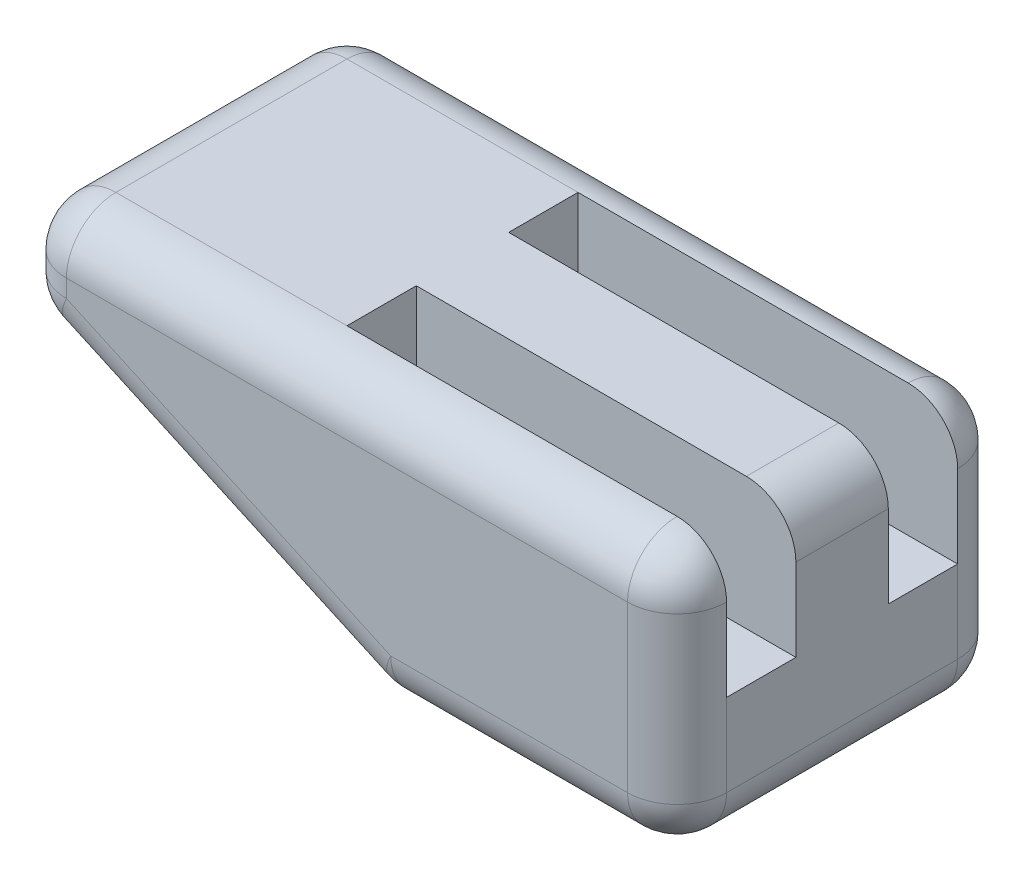
ISO-10303-21;
HEADER;
FILE_DESCRIPTION(('STEP AP214'),'2;1');
FILE_NAME('part.step','',(''),(''),'','','');
FILE_SCHEMA(('AUTOMOTIVE_DESIGN { 1 0 10303 214 1 1 1 1 }'));
ENDSEC;
DATA;
#1=APPLICATION_CONTEXT('core data for automotive mechanical design processes');
#2=APPLICATION_PROTOCOL_DEFINITION('international standard','automotive_design',2000,#1);
#3=PRODUCT_CONTEXT('',#1,'mechanical');
#4=PRODUCT('Part','Part','',(#3));
#5=PRODUCT_RELATED_PRODUCT_CATEGORY('part','',(#4));
#6=PRODUCT_DEFINITION_FORMATION('','',#4);
#7=PRODUCT_DEFINITION_CONTEXT('part definition',#1,'design');
#8=PRODUCT_DEFINITION('design','',#6,#7);
#9=PRODUCT_DEFINITION_SHAPE('','',#8);
#10=(LENGTH_UNIT() NAMED_UNIT(*) SI_UNIT(.MILLI.,.METRE.));
#11=(NAMED_UNIT(*) PLANE_ANGLE_UNIT() SI_UNIT($,.RADIAN.));
#12=(NAMED_UNIT(*) SI_UNIT($,.STERADIAN.) SOLID_ANGLE_UNIT());
#13=UNCERTAINTY_MEASURE_WITH_UNIT(LENGTH_MEASURE(1.E-05),#10,'distance_accuracy_value','');
#14=(GEOMETRIC_REPRESENTATION_CONTEXT(3) GLOBAL_UNCERTAINTY_ASSIGNED_CONTEXT((#13)) GLOBAL_UNIT_ASSIGNED_CONTEXT((#10,
#11,#12)) REPRESENTATION_CONTEXT('',''));
#15=CARTESIAN_POINT('',(0.,0.,0.));
#16=DIRECTION('',(0.,0.,1.));
#17=DIRECTION('',(1.,0.,0.));
#18=AXIS2_PLACEMENT_3D('',#15,#16,#17);
#19=CARTESIAN_POINT('',(0.,-4.,1.5));
#20=DIRECTION('',(0.,0.,-1.));
#21=DIRECTION('',(0.,-1.,0.));
#22=AXIS2_PLACEMENT_3D('',#19,#20,#21);
#23=PLANE('',#22);
#24=DIRECTION('',(0.,1.,0.));
#25=VECTOR('',#24,1.);
#26=CARTESIAN_POINT('',(20.,-8.,1.5));
#27=LINE('',#26,#25);
#28=CARTESIAN_POINT('',(20.,-4.,1.5));
#29=VERTEX_POINT('',#28);
#30=CARTESIAN_POINT('',(20.,-1.5,1.5));
#31=VERTEX_POINT('',#30);
#32=EDGE_CURVE('E227',#29,#31,#27,.T.);
#33=ORIENTED_EDGE('',*,*,#32,.T.);
#34=CARTESIAN_POINT('',(18.5,-1.5,1.5));
#35=DIRECTION('',(0.,0.,1.));
#36=DIRECTION('',(-1.,0.,0.));
#37=AXIS2_PLACEMENT_3D('',#34,#35,#36);
#38=CIRCLE('',#37,1.5);
#39=CARTESIAN_POINT('',(18.5,0.,1.5));
#40=VERTEX_POINT('',#39);
#41=EDGE_CURVE('E487',#31,#40,#38,.T.);
#42=ORIENTED_EDGE('',*,*,#41,.T.);
#43=DIRECTION('',(-1.,0.,0.));
#44=VECTOR('',#43,1.);
#45=CARTESIAN_POINT('',(20.,0.,1.5));
#46=LINE('',#45,#44);
#47=CARTESIAN_POINT('',(8.5,0.,1.5));
#48=VERTEX_POINT('',#47);
#49=EDGE_CURVE('E393',#40,#48,#46,.T.);
#50=ORIENTED_EDGE('',*,*,#49,.T.);
#51=DIRECTION('',(0.,1.,0.));
#52=VECTOR('',#51,1.);
#53=CARTESIAN_POINT('',(8.5,-4.,1.5));
#54=LINE('',#53,#52);
#55=CARTESIAN_POINT('',(8.5,-4.,1.5));
#56=VERTEX_POINT('',#55);
#57=EDGE_CURVE('E11',#56,#48,#54,.T.);
#58=ORIENTED_EDGE('',*,*,#57,.F.);
#59=DIRECTION('',(-1.,0.,0.));
#60=VECTOR('',#59,1.);
#61=CARTESIAN_POINT('',(0.,-4.,1.5));
#62=LINE('',#61,#60);
#63=EDGE_CURVE('E223',#29,#56,#62,.T.);
#64=ORIENTED_EDGE('',*,*,#63,.F.);
#65=EDGE_LOOP('',(#33,#42,#50,#58,#64));
#66=FACE_BOUND('',#65,.T.);
#67=ADVANCED_FACE('F17',(#66),#23,.F.);
#68=CARTESIAN_POINT('',(8.5,-4.,0.));
#69=DIRECTION('',(1.,0.,0.));
#70=DIRECTION('',(0.,1.,0.));
#71=AXIS2_PLACEMENT_3D('',#68,#69,#70);
#72=PLANE('',#71);
#73=DIRECTION('',(0.,0.,-1.));
#74=VECTOR('',#73,1.);
#75=CARTESIAN_POINT('',(8.5,0.,0.));
#76=LINE('',#75,#74);
#77=CARTESIAN_POINT('',(8.5,0.,3.6));
#78=VERTEX_POINT('',#77);
#79=EDGE_CURVE('E545',#78,#48,#76,.T.);
#80=ORIENTED_EDGE('',*,*,#79,.F.);
#81=DIRECTION('',(0.,1.,0.));
#82=VECTOR('',#81,1.);
#83=CARTESIAN_POINT('',(8.5,-4.,3.6));
#84=LINE('',#83,#82);
#85=CARTESIAN_POINT('',(8.5,-4.,3.6));
#86=VERTEX_POINT('',#85);
#87=EDGE_CURVE('E27',#86,#78,#84,.T.);
#88=ORIENTED_EDGE('',*,*,#87,.F.);
#89=DIRECTION('',(0.,0.,-1.));
#90=VECTOR('',#89,1.);
#91=CARTESIAN_POINT('',(8.5,-4.,0.));
#92=LINE('',#91,#90);
#93=EDGE_CURVE('E20',#86,#56,#92,.T.);
#94=ORIENTED_EDGE('',*,*,#93,.T.);
#95=ORIENTED_EDGE('',*,*,#57,.T.);
#96=EDGE_LOOP('',(#80,#88,#94,#95));
#97=FACE_BOUND('',#96,.T.);
#98=ADVANCED_FACE('F630',(#97),#72,.T.);
#99=CARTESIAN_POINT('',(0.,-4.,3.6));
#100=DIRECTION('',(0.,0.,-1.));
#101=DIRECTION('',(-1.,0.,0.));
#102=AXIS2_PLACEMENT_3D('',#99,#100,#101);
#103=PLANE('',#102);
#104=DIRECTION('',(0.,-1.,0.));
#105=VECTOR('',#104,1.);
#106=CARTESIAN_POINT('',(20.,-8.,3.6));
#107=LINE('',#106,#105);
#108=CARTESIAN_POINT('',(20.,-1.5,3.6));
#109=VERTEX_POINT('',#108);
#110=CARTESIAN_POINT('',(20.,-4.,3.6));
#111=VERTEX_POINT('',#110);
#112=EDGE_CURVE('E254',#109,#111,#107,.T.);
#113=ORIENTED_EDGE('',*,*,#112,.T.);
#114=DIRECTION('',(-1.,0.,0.));
#115=VECTOR('',#114,1.);
#116=CARTESIAN_POINT('',(0.,-4.,3.6));
#117=LINE('',#116,#115);
#118=EDGE_CURVE('E249',#111,#86,#117,.T.);
#119=ORIENTED_EDGE('',*,*,#118,.T.);
#120=ORIENTED_EDGE('',*,*,#87,.T.);
#121=DIRECTION('',(-1.,0.,0.));
#122=VECTOR('',#121,1.);
#123=CARTESIAN_POINT('',(0.,0.,3.6));
#124=LINE('',#123,#122);
#125=CARTESIAN_POINT('',(18.5,0.,3.6));
#126=VERTEX_POINT('',#125);
#127=EDGE_CURVE('E550',#126,#78,#124,.T.);
#128=ORIENTED_EDGE('',*,*,#127,.F.);
#129=CARTESIAN_POINT('',(18.5,-1.5,3.6));
#130=DIRECTION('',(0.,0.,1.));
#131=DIRECTION('',(-1.,0.,0.));
#132=AXIS2_PLACEMENT_3D('',#129,#130,#131);
#133=CIRCLE('',#132,1.5);
#134=EDGE_CURVE('E288',#109,#126,#133,.T.);
#135=ORIENTED_EDGE('',*,*,#134,.F.);
#136=EDGE_LOOP('',(#113,#119,#120,#128,#135));
#137=FACE_BOUND('',#136,.T.);
#138=ADVANCED_FACE('F564',(#137),#103,.T.);
#139=CARTESIAN_POINT('',(0.,-4.,0.));
#140=DIRECTION('',(0.,1.,0.));
#141=DIRECTION('',(1.,0.,0.));
#142=AXIS2_PLACEMENT_3D('',#139,#140,#141);
#143=PLANE('',#142);
#144=DIRECTION('',(0.,0.,-1.));
#145=VECTOR('',#144,1.);
#146=CARTESIAN_POINT('',(20.,-4.,10.));
#147=LINE('',#146,#145);
#148=EDGE_CURVE('E248',#111,#29,#147,.T.);
#149=ORIENTED_EDGE('',*,*,#148,.T.);
#150=ORIENTED_EDGE('',*,*,#63,.T.);
#151=ORIENTED_EDGE('',*,*,#93,.F.);
#152=ORIENTED_EDGE('',*,*,#118,.F.);
#153=EDGE_LOOP('',(#149,#150,#151,#152));
#154=FACE_BOUND('',#153,.T.);
#155=ADVANCED_FACE('F247',(#154),#143,.T.);
#156=CARTESIAN_POINT('',(8.5,-4.,0.));
#157=DIRECTION('',(-1.,0.,0.));
#158=DIRECTION('',(0.,1.,0.));
#159=AXIS2_PLACEMENT_3D('',#156,#157,#158);
#160=PLANE('',#159);
#161=DIRECTION('',(0.,0.,1.));
#162=VECTOR('',#161,1.);
#163=CARTESIAN_POINT('',(8.5,0.,0.));
#164=LINE('',#163,#162);
#165=CARTESIAN_POINT('',(8.5,0.,6.4));
#166=VERTEX_POINT('',#165);
#167=CARTESIAN_POINT('',(8.5,0.,8.5));
#168=VERTEX_POINT('',#167);
#169=EDGE_CURVE('E527',#166,#168,#164,.T.);
#170=ORIENTED_EDGE('',*,*,#169,.T.);
#171=DIRECTION('',(0.,1.,0.));
#172=VECTOR('',#171,1.);
#173=CARTESIAN_POINT('',(8.5,-4.,8.5));
#174=LINE('',#173,#172);
#175=CARTESIAN_POINT('',(8.5,-4.,8.5));
#176=VERTEX_POINT('',#175);
#177=EDGE_CURVE('E233',#176,#168,#174,.T.);
#178=ORIENTED_EDGE('',*,*,#177,.F.);
#179=DIRECTION('',(0.,0.,1.));
#180=VECTOR('',#179,1.);
#181=CARTESIAN_POINT('',(8.5,-4.,0.));
#182=LINE('',#181,#180);
#183=CARTESIAN_POINT('',(8.5,-4.,6.4));
#184=VERTEX_POINT('',#183);
#185=EDGE_CURVE('E502',#184,#176,#182,.T.);
#186=ORIENTED_EDGE('',*,*,#185,.F.);
#187=DIRECTION('',(0.,1.,0.));
#188=VECTOR('',#187,1.);
#189=CARTESIAN_POINT('',(8.5,-4.,6.4));
#190=LINE('',#189,#188);
#191=EDGE_CURVE('E273',#184,#166,#190,.T.);
#192=ORIENTED_EDGE('',*,*,#191,.T.);
#193=EDGE_LOOP('',(#170,#178,#186,#192));
#194=FACE_BOUND('',#193,.T.);
#195=ADVANCED_FACE('F529',(#194),#160,.F.);
#196=CARTESIAN_POINT('',(0.,-4.,8.5));
#197=DIRECTION('',(0.,0.,1.));
#198=DIRECTION('',(1.,0.,0.));
#199=AXIS2_PLACEMENT_3D('',#196,#197,#198);
#200=PLANE('',#199);
#201=DIRECTION('',(0.,-1.,0.));
#202=VECTOR('',#201,1.);
#203=CARTESIAN_POINT('',(20.,-8.,8.5));
#204=LINE('',#203,#202);
#205=CARTESIAN_POINT('',(20.,-1.5,8.5));
#206=VERTEX_POINT('',#205);
#207=CARTESIAN_POINT('',(20.,-4.,8.5));
#208=VERTEX_POINT('',#207);
#209=EDGE_CURVE('E362',#206,#208,#204,.T.);
#210=ORIENTED_EDGE('',*,*,#209,.T.);
#211=DIRECTION('',(1.,0.,0.));
#212=VECTOR('',#211,1.);
#213=CARTESIAN_POINT('',(0.,-4.,8.5));
#214=LINE('',#213,#212);
#215=EDGE_CURVE('E506',#176,#208,#214,.T.);
#216=ORIENTED_EDGE('',*,*,#215,.F.);
#217=ORIENTED_EDGE('',*,*,#177,.T.);
#218=DIRECTION('',(1.,0.,0.));
#219=VECTOR('',#218,1.);
#220=CARTESIAN_POINT('',(0.,0.,8.5));
#221=LINE('',#220,#219);
#222=CARTESIAN_POINT('',(18.5,0.,8.5));
#223=VERTEX_POINT('',#222);
#224=EDGE_CURVE('E279',#168,#223,#221,.T.);
#225=ORIENTED_EDGE('',*,*,#224,.T.);
#226=CARTESIAN_POINT('',(18.5,-1.5,8.5));
#227=DIRECTION('',(0.,0.,1.));
#228=DIRECTION('',(1.,0.,0.));
#229=AXIS2_PLACEMENT_3D('',#226,#227,#228);
#230=CIRCLE('',#229,1.5);
#231=EDGE_CURVE('E378',#206,#223,#230,.T.);
#232=ORIENTED_EDGE('',*,*,#231,.F.);
#233=EDGE_LOOP('',(#210,#216,#217,#225,#232));
#234=FACE_BOUND('',#233,.T.);
#235=ADVANCED_FACE('F512',(#234),#200,.F.);
#236=CARTESIAN_POINT('',(0.,-4.,0.));
#237=DIRECTION('',(0.,1.,0.));
#238=DIRECTION('',(1.,0.,0.));
#239=AXIS2_PLACEMENT_3D('',#236,#237,#238);
#240=PLANE('',#239);
#241=DIRECTION('',(0.,0.,-1.));
#242=VECTOR('',#241,1.);
#243=CARTESIAN_POINT('',(20.,-4.,10.));
#244=LINE('',#243,#242);
#245=CARTESIAN_POINT('',(20.,-4.,6.4));
#246=VERTEX_POINT('',#245);
#247=EDGE_CURVE('E276',#208,#246,#244,.T.);
#248=ORIENTED_EDGE('',*,*,#247,.T.);
#249=DIRECTION('',(-1.,0.,0.));
#250=VECTOR('',#249,1.);
#251=CARTESIAN_POINT('',(0.,-4.,6.4));
#252=LINE('',#251,#250);
#253=EDGE_CURVE('E280',#246,#184,#252,.T.);
#254=ORIENTED_EDGE('',*,*,#253,.T.);
#255=ORIENTED_EDGE('',*,*,#185,.T.);
#256=ORIENTED_EDGE('',*,*,#215,.T.);
#257=EDGE_LOOP('',(#248,#254,#255,#256));
#258=FACE_BOUND('',#257,.T.);
#259=ADVANCED_FACE('F580',(#258),#240,.T.);
#260=CARTESIAN_POINT('',(0.,-4.,6.4));
#261=DIRECTION('',(0.,0.,-1.));
#262=DIRECTION('',(0.,-1.,0.));
#263=AXIS2_PLACEMENT_3D('',#260,#261,#262);
#264=PLANE('',#263);
#265=CARTESIAN_POINT('',(18.5,-1.5,6.4));
#266=DIRECTION('',(0.,0.,1.));
#267=DIRECTION('',(-1.,0.,0.));
#268=AXIS2_PLACEMENT_3D('',#265,#266,#267);
#269=CIRCLE('',#268,1.5);
#270=CARTESIAN_POINT('',(20.,-1.5,6.4));
#271=VERTEX_POINT('',#270);
#272=CARTESIAN_POINT('',(18.5,0.,6.4));
#273=VERTEX_POINT('',#272);
#274=EDGE_CURVE('E291',#271,#273,#269,.T.);
#275=ORIENTED_EDGE('',*,*,#274,.T.);
#276=DIRECTION('',(-1.,0.,0.));
#277=VECTOR('',#276,1.);
#278=CARTESIAN_POINT('',(0.,0.,6.4));
#279=LINE('',#278,#277);
#280=EDGE_CURVE('E534',#273,#166,#279,.T.);
#281=ORIENTED_EDGE('',*,*,#280,.T.);
#282=ORIENTED_EDGE('',*,*,#191,.F.);
#283=ORIENTED_EDGE('',*,*,#253,.F.);
#284=DIRECTION('',(0.,-1.,0.));
#285=VECTOR('',#284,1.);
#286=CARTESIAN_POINT('',(20.,-8.,6.4));
#287=LINE('',#286,#285);
#288=EDGE_CURVE('E284',#271,#246,#287,.T.);
#289=ORIENTED_EDGE('',*,*,#288,.F.);
#290=EDGE_LOOP('',(#275,#281,#282,#283,#289));
#291=FACE_BOUND('',#290,.T.);
#292=ADVANCED_FACE('F572',(#291),#264,.F.);
#293=CARTESIAN_POINT('',(0.,-1.5,8.5));
#294=DIRECTION('',(1.,0.,0.));
#295=DIRECTION('',(0.,1.,0.));
#296=AXIS2_PLACEMENT_3D('',#293,#294,#295);
#297=CYLINDRICAL_SURFACE('',#296,1.5);
#298=CARTESIAN_POINT('',(18.5,-1.5,8.5));
#299=DIRECTION('',(-1.,0.,0.));
#300=DIRECTION('',(0.,0.,-1.));
#301=AXIS2_PLACEMENT_3D('',#298,#299,#300);
#302=CIRCLE('',#301,1.5);
#303=CARTESIAN_POINT('',(18.5,-1.5,10.));
#304=VERTEX_POINT('',#303);
#305=EDGE_CURVE('E373',#304,#223,#302,.T.);
#306=ORIENTED_EDGE('',*,*,#305,.T.);
#307=ORIENTED_EDGE('',*,*,#224,.F.);
#308=DIRECTION('',(1.,0.,0.));
#309=VECTOR('',#308,1.);
#310=CARTESIAN_POINT('',(20.,0.,8.5));
#311=LINE('',#310,#309);
#312=CARTESIAN_POINT('',(1.5,0.,8.5));
#313=VERTEX_POINT('',#312);
#314=EDGE_CURVE('E293',#313,#168,#311,.T.);
#315=ORIENTED_EDGE('',*,*,#314,.F.);
#316=CARTESIAN_POINT('',(1.5,-1.5,8.5));
#317=DIRECTION('',(1.,0.,0.));
#318=DIRECTION('',(0.,0.,1.));
#319=AXIS2_PLACEMENT_3D('',#316,#317,#318);
#320=CIRCLE('',#319,1.5);
#321=CARTESIAN_POINT('',(1.5,-1.5,10.));
#322=VERTEX_POINT('',#321);
#323=EDGE_CURVE('E380',#313,#322,#320,.T.);
#324=ORIENTED_EDGE('',*,*,#323,.T.);
#325=DIRECTION('',(-1.,0.,0.));
#326=VECTOR('',#325,1.);
#327=CARTESIAN_POINT('',(0.,-1.5,10.));
#328=LINE('',#327,#326);
#329=EDGE_CURVE('E387',#304,#322,#328,.T.);
#330=ORIENTED_EDGE('',*,*,#329,.F.);
#331=EDGE_LOOP('',(#306,#307,#315,#324,#330));
#332=FACE_BOUND('',#331,.T.);
#333=ADVANCED_FACE('F518',(#332),#297,.T.);
#334=CARTESIAN_POINT('',(1.5,-1.5,8.5));
#335=DIRECTION('',(0.,1.,0.));
#336=DIRECTION('',(0.,0.,1.));
#337=AXIS2_PLACEMENT_3D('',#334,#335,#336);
#338=SPHERICAL_SURFACE('',#337,1.5);
#339=CARTESIAN_POINT('',(1.5,-1.5,8.5));
#340=DIRECTION('',(0.,0.,1.));
#341=DIRECTION('',(1.,0.,0.));
#342=AXIS2_PLACEMENT_3D('',#339,#340,#341);
#343=CIRCLE('',#342,1.5);
#344=CARTESIAN_POINT('',(0.,-1.5,8.5));
#345=VERTEX_POINT('',#344);
#346=EDGE_CURVE('E462',#313,#345,#343,.T.);
#347=ORIENTED_EDGE('',*,*,#346,.T.);
#348=CARTESIAN_POINT('',(1.5,-1.5,8.5));
#349=DIRECTION('',(0.,1.,0.));
#350=DIRECTION('',(0.,0.,1.));
#351=AXIS2_PLACEMENT_3D('',#348,#349,#350);
#352=CIRCLE('',#351,1.5);
#353=EDGE_CURVE('E457',#345,#322,#352,.T.);
#354=ORIENTED_EDGE('',*,*,#353,.T.);
#355=ORIENTED_EDGE('',*,*,#323,.F.);
#356=EDGE_LOOP('',(#347,#354,#355));
#357=FACE_BOUND('',#356,.T.);
#358=ADVANCED_FACE('F1201',(#357),#338,.T.);
#359=CARTESIAN_POINT('',(18.5,-1.5,8.5));
#360=DIRECTION('',(0.,1.,0.));
#361=DIRECTION('',(0.,0.,-1.));
#362=AXIS2_PLACEMENT_3D('',#359,#360,#361);
#363=SPHERICAL_SURFACE('',#362,1.5);
#364=CARTESIAN_POINT('',(18.5,-1.5,8.5));
#365=DIRECTION('',(0.,1.,0.));
#366=DIRECTION('',(0.,0.,1.));
#367=AXIS2_PLACEMENT_3D('',#364,#365,#366);
#368=CIRCLE('',#367,1.5);
#369=EDGE_CURVE('E368',#304,#206,#368,.T.);
#370=ORIENTED_EDGE('',*,*,#369,.T.);
#371=ORIENTED_EDGE('',*,*,#231,.T.);
#372=ORIENTED_EDGE('',*,*,#305,.F.);
#373=EDGE_LOOP('',(#370,#371,#372));
#374=FACE_BOUND('',#373,.T.);
#375=ADVANCED_FACE('F1195',(#374),#363,.T.);
#376=CARTESIAN_POINT('',(1.5,-1.5,10.));
#377=DIRECTION('',(0.,0.,-1.));
#378=DIRECTION('',(-1.,0.,0.));
#379=AXIS2_PLACEMENT_3D('',#376,#377,#378);
#380=CYLINDRICAL_SURFACE('',#379,1.5);
#381=CARTESIAN_POINT('',(1.5,-1.5,1.5));
#382=DIRECTION('',(0.,0.,1.));
#383=DIRECTION('',(-1.,0.,0.));
#384=AXIS2_PLACEMENT_3D('',#381,#382,#383);
#385=CIRCLE('',#384,1.5);
#386=CARTESIAN_POINT('',(1.5,0.,1.5));
#387=VERTEX_POINT('',#386);
#388=CARTESIAN_POINT('',(0.,-1.5,1.5));
#389=VERTEX_POINT('',#388);
#390=EDGE_CURVE('E317',#387,#389,#385,.T.);
#391=ORIENTED_EDGE('',*,*,#390,.T.);
#392=DIRECTION('',(0.,0.,-1.));
#393=VECTOR('',#392,1.);
#394=CARTESIAN_POINT('',(0.,-1.5,10.));
#395=LINE('',#394,#393);
#396=EDGE_CURVE('E330',#345,#389,#395,.T.);
#397=ORIENTED_EDGE('',*,*,#396,.F.);
#398=ORIENTED_EDGE('',*,*,#346,.F.);
#399=DIRECTION('',(0.,0.,1.));
#400=VECTOR('',#399,1.);
#401=CARTESIAN_POINT('',(1.5,0.,10.));
#402=LINE('',#401,#400);
#403=EDGE_CURVE('E297',#387,#313,#402,.T.);
#404=ORIENTED_EDGE('',*,*,#403,.F.);
#405=EDGE_LOOP('',(#391,#397,#398,#404));
#406=FACE_BOUND('',#405,.T.);
#407=ADVANCED_FACE('F1183',(#406),#380,.T.);
#408=CARTESIAN_POINT('',(1.5,0.,8.5));
#409=DIRECTION('',(0.,1.,0.));
#410=DIRECTION('',(0.,0.,1.));
#411=AXIS2_PLACEMENT_3D('',#408,#409,#410);
#412=CYLINDRICAL_SURFACE('',#411,1.5);
#413=CARTESIAN_POINT('',(1.5,-2.03413009450983,8.5));
#414=DIRECTION('',(0.,1.,0.));
#415=DIRECTION('',(1.,0.,0.));
#416=AXIS2_PLACEMENT_3D('',#413,#414,#415);
#417=CIRCLE('',#416,1.5);
#418=CARTESIAN_POINT('',(0.,-2.03413009450983,8.5));
#419=VERTEX_POINT('',#418);
#420=CARTESIAN_POINT('',(1.5,-2.03413009450983,10.));
#421=VERTEX_POINT('',#420);
#422=EDGE_CURVE('E316',#419,#421,#417,.T.);
#423=ORIENTED_EDGE('',*,*,#422,.T.);
#424=DIRECTION('',(0.,-1.,0.));
#425=VECTOR('',#424,1.);
#426=CARTESIAN_POINT('',(1.5,-3.,10.));
#427=LINE('',#426,#425);
#428=EDGE_CURVE('E388',#322,#421,#427,.T.);
#429=ORIENTED_EDGE('',*,*,#428,.F.);
#430=ORIENTED_EDGE('',*,*,#353,.F.);
#431=DIRECTION('',(0.,1.,0.));
#432=VECTOR('',#431,1.);
#433=CARTESIAN_POINT('',(0.,0.,8.5));
#434=LINE('',#433,#432);
#435=EDGE_CURVE('E295',#419,#345,#434,.T.);
#436=ORIENTED_EDGE('',*,*,#435,.F.);
#437=EDGE_LOOP('',(#423,#429,#430,#436));
#438=FACE_BOUND('',#437,.T.);
#439=ADVANCED_FACE('F1174',(#438),#412,.T.);
#440=CARTESIAN_POINT('',(18.5,0.,8.5));
#441=DIRECTION('',(0.,-1.,0.));
#442=DIRECTION('',(0.,0.,-1.));
#443=AXIS2_PLACEMENT_3D('',#440,#441,#442);
#444=CYLINDRICAL_SURFACE('',#443,1.5);
#445=CARTESIAN_POINT('',(18.5,-6.5,8.5));
#446=DIRECTION('',(0.,1.,0.));
#447=DIRECTION('',(0.,0.,-1.));
#448=AXIS2_PLACEMENT_3D('',#445,#446,#447);
#449=CIRCLE('',#448,1.5);
#450=CARTESIAN_POINT('',(18.5,-6.5,10.));
#451=VERTEX_POINT('',#450);
#452=CARTESIAN_POINT('',(20.,-6.5,8.5));
#453=VERTEX_POINT('',#452);
#454=EDGE_CURVE('E271',#451,#453,#449,.T.);
#455=ORIENTED_EDGE('',*,*,#454,.T.);
#456=DIRECTION('',(0.,-1.,0.));
#457=VECTOR('',#456,1.);
#458=CARTESIAN_POINT('',(20.,-8.,8.5));
#459=LINE('',#458,#457);
#460=EDGE_CURVE('E268',#208,#453,#459,.T.);
#461=ORIENTED_EDGE('',*,*,#460,.F.);
#462=ORIENTED_EDGE('',*,*,#209,.F.);
#463=ORIENTED_EDGE('',*,*,#369,.F.);
#464=DIRECTION('',(0.,1.,0.));
#465=VECTOR('',#464,1.);
#466=CARTESIAN_POINT('',(18.5,0.,10.));
#467=LINE('',#466,#465);
#468=EDGE_CURVE('E385',#451,#304,#467,.T.);
#469=ORIENTED_EDGE('',*,*,#468,.F.);
#470=EDGE_LOOP('',(#455,#461,#462,#463,#469));
#471=FACE_BOUND('',#470,.T.);
#472=ADVANCED_FACE('F583',(#471),#444,.T.);
#473=CARTESIAN_POINT('',(1.5,-1.5,1.5));
#474=DIRECTION('',(0.,1.,0.));
#475=DIRECTION('',(-1.,0.,0.));
#476=AXIS2_PLACEMENT_3D('',#473,#474,#475);
#477=SPHERICAL_SURFACE('',#476,1.5);
#478=CARTESIAN_POINT('',(1.5,-1.5,1.5));
#479=DIRECTION('',(-1.,0.,0.));
#480=DIRECTION('',(0.,0.,1.));
#481=AXIS2_PLACEMENT_3D('',#478,#479,#480);
#482=CIRCLE('',#481,1.5);
#483=CARTESIAN_POINT('',(1.5,-1.5,0.));
#484=VERTEX_POINT('',#483);
#485=EDGE_CURVE('E391',#387,#484,#482,.T.);
#486=ORIENTED_EDGE('',*,*,#485,.T.);
#487=CARTESIAN_POINT('',(1.5,-1.5,1.5));
#488=DIRECTION('',(0.,1.,0.));
#489=DIRECTION('',(0.,0.,1.));
#490=AXIS2_PLACEMENT_3D('',#487,#488,#489);
#491=CIRCLE('',#490,1.5);
#492=EDGE_CURVE('E298',#484,#389,#491,.T.);
#493=ORIENTED_EDGE('',*,*,#492,.T.);
#494=ORIENTED_EDGE('',*,*,#390,.F.);
#495=EDGE_LOOP('',(#486,#493,#494));
#496=FACE_BOUND('',#495,.T.);
#497=ADVANCED_FACE('F1159',(#496),#477,.T.);
#498=CARTESIAN_POINT('',(1.5,-2.03413009450983,8.5));
#499=DIRECTION('',(1.,0.,0.));
#500=DIRECTION('',(0.,-1.,0.));
#501=AXIS2_PLACEMENT_3D('',#498,#499,#500);
#502=SPHERICAL_SURFACE('',#501,1.5);
#503=CARTESIAN_POINT('',(1.5,-2.03413009450983,8.5));
#504=DIRECTION('',(0.,0.,1.));
#505=DIRECTION('',(1.,0.,0.));
#506=AXIS2_PLACEMENT_3D('',#503,#504,#505);
#507=CIRCLE('',#506,1.5);
#508=CARTESIAN_POINT('',(0.879295583548224,-3.39967981070374,8.5));
#509=VERTEX_POINT('',#508);
#510=EDGE_CURVE('E302',#419,#509,#507,.T.);
#511=ORIENTED_EDGE('',*,*,#510,.T.);
#512=CARTESIAN_POINT('',(1.5,-2.03413009450983,8.5));
#513=DIRECTION('',(-0.910366477462605,0.413802944301184,0.));
#514=DIRECTION('',(-0.413802944301184,-0.910366477462605,0.));
#515=AXIS2_PLACEMENT_3D('',#512,#513,#514);
#516=CIRCLE('',#515,1.5);
#517=EDGE_CURVE('E478',#509,#421,#516,.T.);
#518=ORIENTED_EDGE('',*,*,#517,.T.);
#519=ORIENTED_EDGE('',*,*,#422,.F.);
#520=EDGE_LOOP('',(#511,#518,#519));
#521=FACE_BOUND('',#520,.T.);
#522=ADVANCED_FACE('F1149',(#521),#502,.T.);
#523=CARTESIAN_POINT('',(18.5,-6.5,8.5));
#524=DIRECTION('',(1.,0.,0.));
#525=DIRECTION('',(0.,0.,-1.));
#526=AXIS2_PLACEMENT_3D('',#523,#524,#525);
#527=SPHERICAL_SURFACE('',#526,1.5);
#528=CARTESIAN_POINT('',(18.5,-6.5,8.5));
#529=DIRECTION('',(1.,0.,0.));
#530=DIRECTION('',(0.,0.,-1.));
#531=AXIS2_PLACEMENT_3D('',#528,#529,#530);
#532=CIRCLE('',#531,1.5);
#533=CARTESIAN_POINT('',(18.5,-8.,8.5));
#534=VERTEX_POINT('',#533);
#535=EDGE_CURVE('E473',#451,#534,#532,.T.);
#536=ORIENTED_EDGE('',*,*,#535,.T.);
#537=CARTESIAN_POINT('',(18.5,-6.5,8.5));
#538=DIRECTION('',(0.,0.,1.));
#539=DIRECTION('',(1.,0.,0.));
#540=AXIS2_PLACEMENT_3D('',#537,#538,#539);
#541=CIRCLE('',#540,1.5);
#542=EDGE_CURVE('E244',#534,#453,#541,.T.);
#543=ORIENTED_EDGE('',*,*,#542,.T.);
#544=ORIENTED_EDGE('',*,*,#454,.F.);
#545=EDGE_LOOP('',(#536,#543,#544));
#546=FACE_BOUND('',#545,.T.);
#547=ADVANCED_FACE('F590',(#546),#527,.T.);
#548=CARTESIAN_POINT('',(18.5,-1.5,1.5));
#549=DIRECTION('',(0.,1.,0.));
#550=DIRECTION('',(-1.,0.,0.));
#551=AXIS2_PLACEMENT_3D('',#548,#549,#550);
#552=SPHERICAL_SURFACE('',#551,1.5);
#553=CARTESIAN_POINT('',(18.5,-1.5,1.5));
#554=DIRECTION('',(0.,1.,0.));
#555=DIRECTION('',(0.,0.,1.));
#556=AXIS2_PLACEMENT_3D('',#553,#554,#555);
#557=CIRCLE('',#556,1.5);
#558=CARTESIAN_POINT('',(18.5,-1.5,0.));
#559=VERTEX_POINT('',#558);
#560=EDGE_CURVE('E242',#31,#559,#557,.T.);
#561=ORIENTED_EDGE('',*,*,#560,.T.);
#562=CARTESIAN_POINT('',(18.5,-1.5,1.5));
#563=DIRECTION('',(1.,0.,0.));
#564=DIRECTION('',(0.,0.,-1.));
#565=AXIS2_PLACEMENT_3D('',#562,#563,#564);
#566=CIRCLE('',#565,1.5);
#567=EDGE_CURVE('E303',#559,#40,#566,.T.);
#568=ORIENTED_EDGE('',*,*,#567,.T.);
#569=ORIENTED_EDGE('',*,*,#41,.F.);
#570=EDGE_LOOP('',(#561,#568,#569));
#571=FACE_BOUND('',#570,.T.);
#572=ADVANCED_FACE('F626',(#571),#552,.T.);
#573=CARTESIAN_POINT('',(20.,-1.5,1.5));
#574=DIRECTION('',(-1.,0.,0.));
#575=DIRECTION('',(0.,-1.,0.));
#576=AXIS2_PLACEMENT_3D('',#573,#574,#575);
#577=CYLINDRICAL_SURFACE('',#576,1.5);
#578=ORIENTED_EDGE('',*,*,#567,.F.);
#579=DIRECTION('',(1.,0.,0.));
#580=VECTOR('',#579,1.);
#581=CARTESIAN_POINT('',(0.,-1.5,0.));
#582=LINE('',#581,#580);
#583=EDGE_CURVE('E408',#484,#559,#582,.T.);
#584=ORIENTED_EDGE('',*,*,#583,.F.);
#585=ORIENTED_EDGE('',*,*,#485,.F.);
#586=DIRECTION('',(-1.,0.,0.));
#587=VECTOR('',#586,1.);
#588=CARTESIAN_POINT('',(20.,0.,1.5));
#589=LINE('',#588,#587);
#590=EDGE_CURVE('E546',#48,#387,#589,.T.);
#591=ORIENTED_EDGE('',*,*,#590,.F.);
#592=ORIENTED_EDGE('',*,*,#49,.F.);
#593=EDGE_LOOP('',(#578,#584,#585,#591,#592));
#594=FACE_BOUND('',#593,.T.);
#595=ADVANCED_FACE('F621',(#594),#577,.T.);
#596=CARTESIAN_POINT('',(1.5,0.,1.5));
#597=DIRECTION('',(0.,-1.,0.));
#598=DIRECTION('',(0.,0.,-1.));
#599=AXIS2_PLACEMENT_3D('',#596,#597,#598);
#600=CYLINDRICAL_SURFACE('',#599,1.5);
#601=CARTESIAN_POINT('',(1.5,-2.03413009450983,1.5));
#602=DIRECTION('',(0.,1.,0.));
#603=DIRECTION('',(0.,0.,-1.));
#604=AXIS2_PLACEMENT_3D('',#601,#602,#603);
#605=CIRCLE('',#604,1.5);
#606=CARTESIAN_POINT('',(1.5,-2.03413009450983,0.));
#607=VERTEX_POINT('',#606);
#608=CARTESIAN_POINT('',(0.,-2.03413009450983,1.5));
#609=VERTEX_POINT('',#608);
#610=EDGE_CURVE('E290',#607,#609,#605,.T.);
#611=ORIENTED_EDGE('',*,*,#610,.T.);
#612=DIRECTION('',(0.,-1.,0.));
#613=VECTOR('',#612,1.);
#614=CARTESIAN_POINT('',(0.,0.,1.5));
#615=LINE('',#614,#613);
#616=EDGE_CURVE('E332',#389,#609,#615,.T.);
#617=ORIENTED_EDGE('',*,*,#616,.F.);
#618=ORIENTED_EDGE('',*,*,#492,.F.);
#619=DIRECTION('',(0.,1.,0.));
#620=VECTOR('',#619,1.);
#621=CARTESIAN_POINT('',(1.5,0.,0.));
#622=LINE('',#621,#620);
#623=EDGE_CURVE('E406',#607,#484,#622,.T.);
#624=ORIENTED_EDGE('',*,*,#623,.F.);
#625=EDGE_LOOP('',(#611,#617,#618,#624));
#626=FACE_BOUND('',#625,.T.);
#627=ADVANCED_FACE('F1117',(#626),#600,.T.);
#628=CARTESIAN_POINT('',(1.5,-2.03413009450983,10.));
#629=DIRECTION('',(0.,0.,-1.));
#630=DIRECTION('',(-1.,0.,0.));
#631=AXIS2_PLACEMENT_3D('',#628,#629,#630);
#632=CYLINDRICAL_SURFACE('',#631,1.5);
#633=CARTESIAN_POINT('',(1.5,-2.03413009450983,1.5));
#634=DIRECTION('',(0.,0.,1.));
#635=DIRECTION('',(-1.,0.,0.));
#636=AXIS2_PLACEMENT_3D('',#633,#634,#635);
#637=CIRCLE('',#636,1.5);
#638=CARTESIAN_POINT('',(0.879295583548224,-3.39967981070374,1.5));
#639=VERTEX_POINT('',#638);
#640=EDGE_CURVE('E283',#609,#639,#637,.T.);
#641=ORIENTED_EDGE('',*,*,#640,.T.);
#642=DIRECTION('',(0.,0.,-1.));
#643=VECTOR('',#642,1.);
#644=CARTESIAN_POINT('',(0.879295583548224,-3.39967981070374,10.));
#645=LINE('',#644,#643);
#646=EDGE_CURVE('E352',#509,#639,#645,.T.);
#647=ORIENTED_EDGE('',*,*,#646,.F.);
#648=ORIENTED_EDGE('',*,*,#510,.F.);
#649=DIRECTION('',(0.,0.,1.));
#650=VECTOR('',#649,1.);
#651=CARTESIAN_POINT('',(0.,-2.03413009450983,10.));
#652=LINE('',#651,#650);
#653=EDGE_CURVE('E333',#609,#419,#652,.T.);
#654=ORIENTED_EDGE('',*,*,#653,.F.);
#655=EDGE_LOOP('',(#641,#647,#648,#654));
#656=FACE_BOUND('',#655,.T.);
#657=ADVANCED_FACE('F997',(#656),#632,.T.);
#658=CARTESIAN_POINT('',(-0.509432569849594,-1.12075165366911,8.5));
#659=DIRECTION('',(-0.910366477462605,0.413802944301184,0.));
#660=DIRECTION('',(-0.413802944301184,-0.910366477462605,0.));
#661=AXIS2_PLACEMENT_3D('',#658,#659,#660);
#662=CYLINDRICAL_SURFACE('',#661,1.5);
#663=CARTESIAN_POINT('',(11.3249137920784,-6.5,8.5));
#664=DIRECTION('',(-0.910366477462604,0.413802944301185,0.));
#665=DIRECTION('',(0.413802944301185,0.910366477462604,0.));
#666=AXIS2_PLACEMENT_3D('',#663,#664,#665);
#667=CIRCLE('',#666,1.5);
#668=CARTESIAN_POINT('',(10.7042093756266,-7.86554971619391,8.5));
#669=VERTEX_POINT('',#668);
#670=CARTESIAN_POINT('',(11.3249137920784,-6.5,10.));
#671=VERTEX_POINT('',#670);
#672=EDGE_CURVE('E454',#669,#671,#667,.T.);
#673=ORIENTED_EDGE('',*,*,#672,.T.);
#674=DIRECTION('',(0.910366477462605,-0.413802944301184,0.));
#675=VECTOR('',#674,1.);
#676=CARTESIAN_POINT('',(11.6207044164518,-6.6344502838061,10.));
#677=LINE('',#676,#675);
#678=EDGE_CURVE('E398',#421,#671,#677,.T.);
#679=ORIENTED_EDGE('',*,*,#678,.F.);
#680=ORIENTED_EDGE('',*,*,#517,.F.);
#681=DIRECTION('',(-0.910366477462605,0.413802944301184,0.));
#682=VECTOR('',#681,1.);
#683=CARTESIAN_POINT('',(0.,-3.,8.5));
#684=LINE('',#683,#682);
#685=EDGE_CURVE('E343',#669,#509,#684,.T.);
#686=ORIENTED_EDGE('',*,*,#685,.F.);
#687=EDGE_LOOP('',(#673,#679,#680,#686));
#688=FACE_BOUND('',#687,.T.);
#689=ADVANCED_FACE('F995',(#688),#662,.T.);
#690=CARTESIAN_POINT('',(0.,-6.5,8.5));
#691=DIRECTION('',(-1.,0.,0.));
#692=DIRECTION('',(0.,0.,1.));
#693=AXIS2_PLACEMENT_3D('',#690,#691,#692);
#694=CYLINDRICAL_SURFACE('',#693,1.5);
#695=CARTESIAN_POINT('',(11.3249137920784,-6.5,8.5));
#696=DIRECTION('',(1.,0.,0.));
#697=DIRECTION('',(0.,0.,1.));
#698=AXIS2_PLACEMENT_3D('',#695,#696,#697);
#699=CIRCLE('',#698,1.5);
#700=CARTESIAN_POINT('',(11.3249137920784,-8.,8.5));
#701=VERTEX_POINT('',#700);
#702=EDGE_CURVE('E309',#671,#701,#699,.T.);
#703=ORIENTED_EDGE('',*,*,#702,.T.);
#704=DIRECTION('',(-1.,0.,0.));
#705=VECTOR('',#704,1.);
#706=CARTESIAN_POINT('',(11.,-8.,8.5));
#707=LINE('',#706,#705);
#708=EDGE_CURVE('E347',#534,#701,#707,.T.);
#709=ORIENTED_EDGE('',*,*,#708,.F.);
#710=ORIENTED_EDGE('',*,*,#535,.F.);
#711=DIRECTION('',(1.,0.,0.));
#712=VECTOR('',#711,1.);
#713=CARTESIAN_POINT('',(20.,-6.5,10.));
#714=LINE('',#713,#712);
#715=EDGE_CURVE('E401',#671,#451,#714,.T.);
#716=ORIENTED_EDGE('',*,*,#715,.F.);
#717=EDGE_LOOP('',(#703,#709,#710,#716));
#718=FACE_BOUND('',#717,.T.);
#719=ADVANCED_FACE('F996',(#718),#694,.T.);
#720=CARTESIAN_POINT('',(18.5,-6.5,10.));
#721=DIRECTION('',(0.,0.,-1.));
#722=DIRECTION('',(-1.,0.,0.));
#723=AXIS2_PLACEMENT_3D('',#720,#721,#722);
#724=CYLINDRICAL_SURFACE('',#723,1.5);
#725=CARTESIAN_POINT('',(18.5,-6.5,1.5));
#726=DIRECTION('',(0.,0.,1.));
#727=DIRECTION('',(-1.,0.,0.));
#728=AXIS2_PLACEMENT_3D('',#725,#726,#727);
#729=CIRCLE('',#728,1.5);
#730=CARTESIAN_POINT('',(18.5,-8.,1.5));
#731=VERTEX_POINT('',#730);
#732=CARTESIAN_POINT('',(20.,-6.5,1.5));
#733=VERTEX_POINT('',#732);
#734=EDGE_CURVE('E449',#731,#733,#729,.T.);
#735=ORIENTED_EDGE('',*,*,#734,.T.);
#736=DIRECTION('',(0.,0.,-1.));
#737=VECTOR('',#736,1.);
#738=CARTESIAN_POINT('',(20.,-6.5,10.));
#739=LINE('',#738,#737);
#740=EDGE_CURVE('E261',#453,#733,#739,.T.);
#741=ORIENTED_EDGE('',*,*,#740,.F.);
#742=ORIENTED_EDGE('',*,*,#542,.F.);
#743=DIRECTION('',(0.,0.,1.));
#744=VECTOR('',#743,1.);
#745=CARTESIAN_POINT('',(18.5,-8.,10.));
#746=LINE('',#745,#744);
#747=EDGE_CURVE('E363',#731,#534,#746,.T.);
#748=ORIENTED_EDGE('',*,*,#747,.F.);
#749=EDGE_LOOP('',(#735,#741,#742,#748));
#750=FACE_BOUND('',#749,.T.);
#751=ADVANCED_FACE('F591',(#750),#724,.T.);
#752=CARTESIAN_POINT('',(18.5,-8.,1.5));
#753=DIRECTION('',(0.,1.,0.));
#754=DIRECTION('',(0.,0.,1.));
#755=AXIS2_PLACEMENT_3D('',#752,#753,#754);
#756=CYLINDRICAL_SURFACE('',#755,1.5);
#757=CARTESIAN_POINT('',(18.5,-6.5,1.5));
#758=DIRECTION('',(0.,1.,0.));
#759=DIRECTION('',(0.,0.,-1.));
#760=AXIS2_PLACEMENT_3D('',#757,#758,#759);
#761=CIRCLE('',#760,1.5);
#762=CARTESIAN_POINT('',(18.5,-6.5,0.));
#763=VERTEX_POINT('',#762);
#764=EDGE_CURVE('E455',#733,#763,#761,.T.);
#765=ORIENTED_EDGE('',*,*,#764,.T.);
#766=DIRECTION('',(0.,-1.,0.));
#767=VECTOR('',#766,1.);
#768=CARTESIAN_POINT('',(18.5,0.,0.));
#769=LINE('',#768,#767);
#770=EDGE_CURVE('E412',#559,#763,#769,.T.);
#771=ORIENTED_EDGE('',*,*,#770,.F.);
#772=ORIENTED_EDGE('',*,*,#560,.F.);
#773=ORIENTED_EDGE('',*,*,#32,.F.);
#774=DIRECTION('',(0.,1.,0.));
#775=VECTOR('',#774,1.);
#776=CARTESIAN_POINT('',(20.,-8.,1.5));
#777=LINE('',#776,#775);
#778=EDGE_CURVE('E237',#733,#29,#777,.T.);
#779=ORIENTED_EDGE('',*,*,#778,.F.);
#780=EDGE_LOOP('',(#765,#771,#772,#773,#779));
#781=FACE_BOUND('',#780,.T.);
#782=ADVANCED_FACE('F236',(#781),#756,.T.);
#783=CARTESIAN_POINT('',(1.5,-2.03413009450983,1.5));
#784=DIRECTION('',(0.,1.,0.));
#785=DIRECTION('',(-1.,0.,0.));
#786=AXIS2_PLACEMENT_3D('',#783,#784,#785);
#787=SPHERICAL_SURFACE('',#786,1.5);
#788=ORIENTED_EDGE('',*,*,#610,.F.);
#789=CARTESIAN_POINT('',(1.5,-2.03413009450983,1.5));
#790=DIRECTION('',(-0.910366477462605,0.413802944301184,0.));
#791=DIRECTION('',(-0.413802944301184,-0.910366477462605,0.));
#792=AXIS2_PLACEMENT_3D('',#789,#790,#791);
#793=CIRCLE('',#792,1.5);
#794=EDGE_CURVE('E434',#607,#639,#793,.T.);
#795=ORIENTED_EDGE('',*,*,#794,.T.);
#796=ORIENTED_EDGE('',*,*,#640,.F.);
#797=EDGE_LOOP('',(#788,#795,#796));
#798=FACE_BOUND('',#797,.T.);
#799=ADVANCED_FACE('F968',(#798),#787,.T.);
#800=CARTESIAN_POINT('',(11.3249137920784,-6.5,8.5));
#801=DIRECTION('',(0.,1.,0.));
#802=DIRECTION('',(1.,0.,0.));
#803=AXIS2_PLACEMENT_3D('',#800,#801,#802);
#804=SPHERICAL_SURFACE('',#803,1.5);
#805=ORIENTED_EDGE('',*,*,#672,.F.);
#806=CARTESIAN_POINT('',(11.3249137920784,-6.5,8.5));
#807=DIRECTION('',(0.,0.,1.));
#808=DIRECTION('',(1.,0.,0.));
#809=AXIS2_PLACEMENT_3D('',#806,#807,#808);
#810=CIRCLE('',#809,1.5);
#811=EDGE_CURVE('E431',#669,#701,#810,.T.);
#812=ORIENTED_EDGE('',*,*,#811,.T.);
#813=ORIENTED_EDGE('',*,*,#702,.F.);
#814=EDGE_LOOP('',(#805,#812,#813));
#815=FACE_BOUND('',#814,.T.);
#816=ADVANCED_FACE('F965',(#815),#804,.T.);
#817=CARTESIAN_POINT('',(18.5,-6.5,1.5));
#818=DIRECTION('',(0.,1.,0.));
#819=DIRECTION('',(-1.,0.,0.));
#820=AXIS2_PLACEMENT_3D('',#817,#818,#819);
#821=SPHERICAL_SURFACE('',#820,1.5);
#822=ORIENTED_EDGE('',*,*,#734,.F.);
#823=CARTESIAN_POINT('',(18.5,-6.5,1.5));
#824=DIRECTION('',(1.,0.,0.));
#825=DIRECTION('',(0.,0.,-1.));
#826=AXIS2_PLACEMENT_3D('',#823,#824,#825);
#827=CIRCLE('',#826,1.5);
#828=EDGE_CURVE('E436',#731,#763,#827,.T.);
#829=ORIENTED_EDGE('',*,*,#828,.T.);
#830=ORIENTED_EDGE('',*,*,#764,.F.);
#831=EDGE_LOOP('',(#822,#829,#830));
#832=FACE_BOUND('',#831,.T.);
#833=ADVANCED_FACE('F592',(#832),#821,.T.);
#834=CARTESIAN_POINT('',(0.620704416451776,-1.63445028380609,1.5));
#835=DIRECTION('',(0.910366477462605,-0.413802944301184,0.));
#836=DIRECTION('',(0.413802944301184,0.910366477462605,0.));
#837=AXIS2_PLACEMENT_3D('',#834,#835,#836);
#838=CYLINDRICAL_SURFACE('',#837,1.5);
#839=CARTESIAN_POINT('',(11.3249137920784,-6.5,1.5));
#840=DIRECTION('',(-0.910366477462605,0.413802944301184,0.));
#841=DIRECTION('',(0.413802944301184,0.910366477462605,0.));
#842=AXIS2_PLACEMENT_3D('',#839,#840,#841);
#843=CIRCLE('',#842,1.5);
#844=CARTESIAN_POINT('',(11.3249137920784,-6.5,0.));
#845=VERTEX_POINT('',#844);
#846=CARTESIAN_POINT('',(10.7042093756266,-7.86554971619391,1.5));
#847=VERTEX_POINT('',#846);
#848=EDGE_CURVE('E426',#845,#847,#843,.T.);
#849=ORIENTED_EDGE('',*,*,#848,.T.);
#850=DIRECTION('',(0.910366477462605,-0.413802944301184,0.));
#851=VECTOR('',#850,1.);
#852=CARTESIAN_POINT('',(0.,-3.,1.5));
#853=LINE('',#852,#851);
#854=EDGE_CURVE('E360',#639,#847,#853,.T.);
#855=ORIENTED_EDGE('',*,*,#854,.F.);
#856=ORIENTED_EDGE('',*,*,#794,.F.);
#857=DIRECTION('',(-0.910366477462605,0.413802944301184,0.));
#858=VECTOR('',#857,1.);
#859=CARTESIAN_POINT('',(-0.509432569849594,-1.12075165366911,0.));
#860=LINE('',#859,#858);
#861=EDGE_CURVE('E425',#845,#607,#860,.T.);
#862=ORIENTED_EDGE('',*,*,#861,.F.);
#863=EDGE_LOOP('',(#849,#855,#856,#862));
#864=FACE_BOUND('',#863,.T.);
#865=ADVANCED_FACE('F615',(#864),#838,.T.);
#866=CARTESIAN_POINT('',(11.3249137920784,-6.5,10.));
#867=DIRECTION('',(0.,0.,-1.));
#868=DIRECTION('',(-1.,0.,0.));
#869=AXIS2_PLACEMENT_3D('',#866,#867,#868);
#870=CYLINDRICAL_SURFACE('',#869,1.5);
#871=CARTESIAN_POINT('',(11.3249137920784,-6.5,1.5));
#872=DIRECTION('',(0.,0.,1.));
#873=DIRECTION('',(-1.,0.,0.));
#874=AXIS2_PLACEMENT_3D('',#871,#872,#873);
#875=CIRCLE('',#874,1.5);
#876=CARTESIAN_POINT('',(11.3249137920784,-8.,1.5));
#877=VERTEX_POINT('',#876);
#878=EDGE_CURVE('E438',#847,#877,#875,.T.);
#879=ORIENTED_EDGE('',*,*,#878,.T.);
#880=DIRECTION('',(0.,0.,-1.));
#881=VECTOR('',#880,1.);
#882=CARTESIAN_POINT('',(11.3249137920784,-8.,10.));
#883=LINE('',#882,#881);
#884=EDGE_CURVE('E342',#701,#877,#883,.T.);
#885=ORIENTED_EDGE('',*,*,#884,.F.);
#886=ORIENTED_EDGE('',*,*,#811,.F.);
#887=DIRECTION('',(0.,0.,1.));
#888=VECTOR('',#887,1.);
#889=CARTESIAN_POINT('',(10.7042093756266,-7.86554971619391,10.));
#890=LINE('',#889,#888);
#891=EDGE_CURVE('E338',#847,#669,#890,.T.);
#892=ORIENTED_EDGE('',*,*,#891,.F.);
#893=EDGE_LOOP('',(#879,#885,#886,#892));
#894=FACE_BOUND('',#893,.T.);
#895=ADVANCED_FACE('F603',(#894),#870,.T.);
#896=CARTESIAN_POINT('',(11.,-6.5,1.5));
#897=DIRECTION('',(1.,0.,0.));
#898=DIRECTION('',(0.,0.,-1.));
#899=AXIS2_PLACEMENT_3D('',#896,#897,#898);
#900=CYLINDRICAL_SURFACE('',#899,1.5);
#901=CARTESIAN_POINT('',(11.3249137920784,-6.5,1.5));
#902=DIRECTION('',(1.,0.,0.));
#903=DIRECTION('',(0.,0.,1.));
#904=AXIS2_PLACEMENT_3D('',#901,#902,#903);
#905=CIRCLE('',#904,1.5);
#906=EDGE_CURVE('E429',#877,#845,#905,.T.);
#907=ORIENTED_EDGE('',*,*,#906,.T.);
#908=DIRECTION('',(-1.,0.,0.));
#909=VECTOR('',#908,1.);
#910=CARTESIAN_POINT('',(0.,-6.5,0.));
#911=LINE('',#910,#909);
#912=EDGE_CURVE('E416',#763,#845,#911,.T.);
#913=ORIENTED_EDGE('',*,*,#912,.F.);
#914=ORIENTED_EDGE('',*,*,#828,.F.);
#915=DIRECTION('',(1.,0.,0.));
#916=VECTOR('',#915,1.);
#917=CARTESIAN_POINT('',(11.,-8.,1.5));
#918=LINE('',#917,#916);
#919=EDGE_CURVE('E348',#877,#731,#918,.T.);
#920=ORIENTED_EDGE('',*,*,#919,.F.);
#921=EDGE_LOOP('',(#907,#913,#914,#920));
#922=FACE_BOUND('',#921,.T.);
#923=ADVANCED_FACE('F598',(#922),#900,.T.);
#924=CARTESIAN_POINT('',(11.3249137920784,-6.5,1.5));
#925=DIRECTION('',(0.,1.,0.));
#926=DIRECTION('',(-1.,0.,0.));
#927=AXIS2_PLACEMENT_3D('',#924,#925,#926);
#928=SPHERICAL_SURFACE('',#927,1.5);
#929=ORIENTED_EDGE('',*,*,#848,.F.);
#930=ORIENTED_EDGE('',*,*,#906,.F.);
#931=ORIENTED_EDGE('',*,*,#878,.F.);
#932=EDGE_LOOP('',(#929,#930,#931));
#933=FACE_BOUND('',#932,.T.);
#934=ADVANCED_FACE('F608',(#933),#928,.T.);
#935=CARTESIAN_POINT('',(0.,0.,0.));
#936=DIRECTION('',(0.,0.,1.));
#937=DIRECTION('',(1.,0.,0.));
#938=AXIS2_PLACEMENT_3D('',#935,#936,#937);
#939=PLANE('',#938);
#940=ORIENTED_EDGE('',*,*,#623,.T.);
#941=ORIENTED_EDGE('',*,*,#583,.T.);
#942=ORIENTED_EDGE('',*,*,#770,.T.);
#943=ORIENTED_EDGE('',*,*,#912,.T.);
#944=ORIENTED_EDGE('',*,*,#861,.T.);
#945=EDGE_LOOP('',(#940,#941,#942,#943,#944));
#946=FACE_BOUND('',#945,.T.);
#947=ADVANCED_FACE('F618',(#946),#939,.F.);
#948=CARTESIAN_POINT('',(0.,0.,10.));
#949=DIRECTION('',(0.,0.,1.));
#950=DIRECTION('',(1.,0.,0.));
#951=AXIS2_PLACEMENT_3D('',#948,#949,#950);
#952=PLANE('',#951);
#953=ORIENTED_EDGE('',*,*,#468,.T.);
#954=ORIENTED_EDGE('',*,*,#329,.T.);
#955=ORIENTED_EDGE('',*,*,#428,.T.);
#956=ORIENTED_EDGE('',*,*,#678,.T.);
#957=ORIENTED_EDGE('',*,*,#715,.T.);
#958=EDGE_LOOP('',(#953,#954,#955,#956,#957));
#959=FACE_BOUND('',#958,.T.);
#960=ADVANCED_FACE('F1057',(#959),#952,.T.);
#961=CARTESIAN_POINT('',(11.,-8.,10.));
#962=DIRECTION('',(0.,1.,0.));
#963=DIRECTION('',(1.,0.,0.));
#964=AXIS2_PLACEMENT_3D('',#961,#962,#963);
#965=PLANE('',#964);
#966=ORIENTED_EDGE('',*,*,#747,.T.);
#967=ORIENTED_EDGE('',*,*,#708,.T.);
#968=ORIENTED_EDGE('',*,*,#884,.T.);
#969=ORIENTED_EDGE('',*,*,#919,.T.);
#970=EDGE_LOOP('',(#966,#967,#968,#969));
#971=FACE_BOUND('',#970,.T.);
#972=ADVANCED_FACE('F599',(#971),#965,.F.);
#973=CARTESIAN_POINT('',(0.,-3.,10.));
#974=DIRECTION('',(0.413802944301184,0.910366477462605,0.));
#975=DIRECTION('',(0.,0.,-1.));
#976=AXIS2_PLACEMENT_3D('',#973,#974,#975);
#977=PLANE('',#976);
#978=ORIENTED_EDGE('',*,*,#891,.T.);
#979=ORIENTED_EDGE('',*,*,#685,.T.);
#980=ORIENTED_EDGE('',*,*,#646,.T.);
#981=ORIENTED_EDGE('',*,*,#854,.T.);
#982=EDGE_LOOP('',(#978,#979,#980,#981));
#983=FACE_BOUND('',#982,.T.);
#984=ADVANCED_FACE('F1026',(#983),#977,.F.);
#985=CARTESIAN_POINT('',(0.,0.,10.));
#986=DIRECTION('',(1.,0.,0.));
#987=DIRECTION('',(0.,1.,0.));
#988=AXIS2_PLACEMENT_3D('',#985,#986,#987);
#989=PLANE('',#988);
#990=ORIENTED_EDGE('',*,*,#435,.T.);
#991=ORIENTED_EDGE('',*,*,#396,.T.);
#992=ORIENTED_EDGE('',*,*,#616,.T.);
#993=ORIENTED_EDGE('',*,*,#653,.T.);
#994=EDGE_LOOP('',(#990,#991,#992,#993));
#995=FACE_BOUND('',#994,.T.);
#996=ADVANCED_FACE('F1019',(#995),#989,.F.);
#997=CARTESIAN_POINT('',(18.5,-1.5,10.));
#998=DIRECTION('',(0.,0.,-1.));
#999=DIRECTION('',(-1.,0.,0.));
#1000=AXIS2_PLACEMENT_3D('',#997,#998,#999);
#1001=CYLINDRICAL_SURFACE('',#1000,1.5);
#1002=ORIENTED_EDGE('',*,*,#274,.F.);
#1003=DIRECTION('',(0.,0.,1.));
#1004=VECTOR('',#1003,1.);
#1005=CARTESIAN_POINT('',(20.,-1.5,10.));
#1006=LINE('',#1005,#1004);
#1007=EDGE_CURVE('E300',#109,#271,#1006,.T.);
#1008=ORIENTED_EDGE('',*,*,#1007,.F.);
#1009=ORIENTED_EDGE('',*,*,#134,.T.);
#1010=DIRECTION('',(0.,0.,-1.));
#1011=VECTOR('',#1010,1.);
#1012=CARTESIAN_POINT('',(18.5,0.,10.));
#1013=LINE('',#1012,#1011);
#1014=EDGE_CURVE('E537',#273,#126,#1013,.T.);
#1015=ORIENTED_EDGE('',*,*,#1014,.F.);
#1016=EDGE_LOOP('',(#1002,#1008,#1009,#1015));
#1017=FACE_BOUND('',#1016,.T.);
#1018=ADVANCED_FACE('F567',(#1017),#1001,.T.);
#1019=CARTESIAN_POINT('',(20.,-8.,10.));
#1020=DIRECTION('',(-1.,0.,0.));
#1021=DIRECTION('',(0.,0.,1.));
#1022=AXIS2_PLACEMENT_3D('',#1019,#1020,#1021);
#1023=PLANE('',#1022);
#1024=ORIENTED_EDGE('',*,*,#1007,.T.);
#1025=ORIENTED_EDGE('',*,*,#288,.T.);
#1026=ORIENTED_EDGE('',*,*,#247,.F.);
#1027=ORIENTED_EDGE('',*,*,#460,.T.);
#1028=ORIENTED_EDGE('',*,*,#740,.T.);
#1029=ORIENTED_EDGE('',*,*,#778,.T.);
#1030=ORIENTED_EDGE('',*,*,#148,.F.);
#1031=ORIENTED_EDGE('',*,*,#112,.F.);
#1032=EDGE_LOOP('',(#1024,#1025,#1026,#1027,#1028,#1029,#1030,#1031));
#1033=FACE_BOUND('',#1032,.T.);
#1034=ADVANCED_FACE('F256',(#1033),#1023,.F.);
#1035=CARTESIAN_POINT('',(20.,0.,10.));
#1036=DIRECTION('',(0.,-1.,0.));
#1037=DIRECTION('',(0.,0.,-1.));
#1038=AXIS2_PLACEMENT_3D('',#1035,#1036,#1037);
#1039=PLANE('',#1038);
#1040=ORIENTED_EDGE('',*,*,#169,.F.);
#1041=ORIENTED_EDGE('',*,*,#280,.F.);
#1042=ORIENTED_EDGE('',*,*,#1014,.T.);
#1043=ORIENTED_EDGE('',*,*,#127,.T.);
#1044=ORIENTED_EDGE('',*,*,#79,.T.);
#1045=ORIENTED_EDGE('',*,*,#590,.T.);
#1046=ORIENTED_EDGE('',*,*,#403,.T.);
#1047=ORIENTED_EDGE('',*,*,#314,.T.);
#1048=EDGE_LOOP('',(#1040,#1041,#1042,#1043,#1044,#1045,#1046,#1047));
#1049=FACE_BOUND('',#1048,.T.);
#1050=ADVANCED_FACE('F524',(#1049),#1039,.F.);
#1051=CLOSED_SHELL('',(#67,#98,#138,#155,#195,#235,#259,#292,#333,#358,#375,#407,#439,#472,#497,
#522,#547,#572,#595,#627,#657,#689,#719,#751,#782,#799,#816,#833,#865,#895,#923,#934,#947,#960,
#972,#984,#996,#1018,#1034,#1050));
#1052=MANIFOLD_SOLID_BREP('B1',#1051);
#1053=ADVANCED_BREP_SHAPE_REPRESENTATION('',(#18,#1052),#14);
#1054=SHAPE_DEFINITION_REPRESENTATION(#9,#1053);
ENDSEC;
END-ISO-10303-21;
